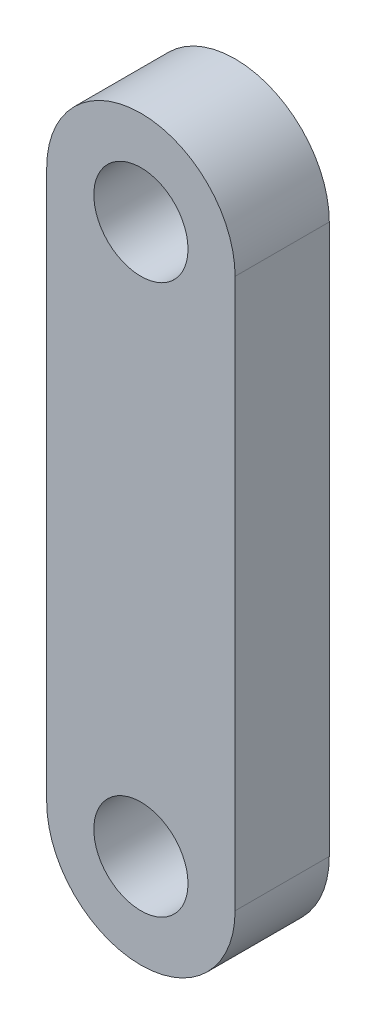
ISO-10303-21;
HEADER;
FILE_DESCRIPTION(('STEP AP214'),'2;1');
FILE_NAME('part.step','',(''),(''),'','','');
FILE_SCHEMA(('AUTOMOTIVE_DESIGN { 1 0 10303 214 1 1 1 1 }'));
ENDSEC;
DATA;
#1=APPLICATION_CONTEXT('core data for automotive mechanical design processes');
#2=APPLICATION_PROTOCOL_DEFINITION('international standard','automotive_design',2000,#1);
#3=PRODUCT_CONTEXT('',#1,'mechanical');
#4=PRODUCT('Part','Part','',(#3));
#5=PRODUCT_RELATED_PRODUCT_CATEGORY('part','',(#4));
#6=PRODUCT_DEFINITION_FORMATION('','',#4);
#7=PRODUCT_DEFINITION_CONTEXT('part definition',#1,'design');
#8=PRODUCT_DEFINITION('design','',#6,#7);
#9=PRODUCT_DEFINITION_SHAPE('','',#8);
#10=(LENGTH_UNIT() NAMED_UNIT(*) SI_UNIT(.MILLI.,.METRE.));
#11=(NAMED_UNIT(*) PLANE_ANGLE_UNIT() SI_UNIT($,.RADIAN.));
#12=(NAMED_UNIT(*) SI_UNIT($,.STERADIAN.) SOLID_ANGLE_UNIT());
#13=UNCERTAINTY_MEASURE_WITH_UNIT(LENGTH_MEASURE(1.E-05),#10,'distance_accuracy_value','');
#14=(GEOMETRIC_REPRESENTATION_CONTEXT(3) GLOBAL_UNCERTAINTY_ASSIGNED_CONTEXT((#13)) GLOBAL_UNIT_ASSIGNED_CONTEXT((#10,
#11,#12)) REPRESENTATION_CONTEXT('',''));
#15=CARTESIAN_POINT('',(0.,0.,0.));
#16=DIRECTION('',(0.,0.,1.));
#17=DIRECTION('',(1.,0.,0.));
#18=AXIS2_PLACEMENT_3D('',#15,#16,#17);
#19=CARTESIAN_POINT('',(0.,8.75,-4.5));
#20=DIRECTION('',(0.,0.,1.));
#21=DIRECTION('',(1.,0.,0.));
#22=AXIS2_PLACEMENT_3D('',#19,#20,#21);
#23=CYLINDRICAL_SURFACE('',#22,3.);
#24=CARTESIAN_POINT('',(0.,8.75,-1.5));
#25=DIRECTION('',(0.,0.,1.));
#26=DIRECTION('',(1.,0.,0.));
#27=AXIS2_PLACEMENT_3D('',#24,#25,#26);
#28=CIRCLE('',#27,3.);
#29=CARTESIAN_POINT('',(2.99999999999999,8.75,-1.5));
#30=VERTEX_POINT('',#29);
#31=CARTESIAN_POINT('',(-3.,8.75,-1.5));
#32=VERTEX_POINT('',#31);
#33=EDGE_CURVE('E100',#30,#32,#28,.T.);
#34=ORIENTED_EDGE('',*,*,#33,.F.);
#35=DIRECTION('',(0.,0.,1.));
#36=VECTOR('',#35,1.);
#37=CARTESIAN_POINT('',(2.99999999999999,8.75,-4.5));
#38=LINE('',#37,#36);
#39=CARTESIAN_POINT('',(2.99999999999999,8.75,-4.5));
#40=VERTEX_POINT('',#39);
#41=EDGE_CURVE('E11',#40,#30,#38,.T.);
#42=ORIENTED_EDGE('',*,*,#41,.F.);
#43=CARTESIAN_POINT('',(0.,8.75,-4.5));
#44=DIRECTION('',(0.,0.,1.));
#45=DIRECTION('',(1.,0.,0.));
#46=AXIS2_PLACEMENT_3D('',#43,#44,#45);
#47=CIRCLE('',#46,3.);
#48=CARTESIAN_POINT('',(-3.,8.75,-4.5));
#49=VERTEX_POINT('',#48);
#50=EDGE_CURVE('E93',#40,#49,#47,.T.);
#51=ORIENTED_EDGE('',*,*,#50,.T.);
#52=DIRECTION('',(0.,0.,1.));
#53=VECTOR('',#52,1.);
#54=CARTESIAN_POINT('',(-3.,8.75,-4.5));
#55=LINE('',#54,#53);
#56=EDGE_CURVE('E38',#49,#32,#55,.T.);
#57=ORIENTED_EDGE('',*,*,#56,.T.);
#58=EDGE_LOOP('',(#34,#42,#51,#57));
#59=FACE_BOUND('',#58,.T.);
#60=ADVANCED_FACE('F35',(#59),#23,.T.);
#61=CARTESIAN_POINT('',(2.99999999999999,8.75,-4.5));
#62=DIRECTION('',(1.,0.,0.));
#63=DIRECTION('',(0.,1.,0.));
#64=AXIS2_PLACEMENT_3D('',#61,#62,#63);
#65=PLANE('',#64);
#66=DIRECTION('',(0.,1.,0.));
#67=VECTOR('',#66,1.);
#68=CARTESIAN_POINT('',(2.99999999999999,8.75,-1.5));
#69=LINE('',#68,#67);
#70=CARTESIAN_POINT('',(3.,-8.75,-1.5));
#71=VERTEX_POINT('',#70);
#72=EDGE_CURVE('E95',#71,#30,#69,.T.);
#73=ORIENTED_EDGE('',*,*,#72,.F.);
#74=DIRECTION('',(0.,0.,1.));
#75=VECTOR('',#74,1.);
#76=CARTESIAN_POINT('',(3.,-8.75,-4.5));
#77=LINE('',#76,#75);
#78=CARTESIAN_POINT('',(3.,-8.75,-4.5));
#79=VERTEX_POINT('',#78);
#80=EDGE_CURVE('E44',#79,#71,#77,.T.);
#81=ORIENTED_EDGE('',*,*,#80,.F.);
#82=DIRECTION('',(0.,1.,0.));
#83=VECTOR('',#82,1.);
#84=CARTESIAN_POINT('',(2.99999999999999,8.75,-4.5));
#85=LINE('',#84,#83);
#86=EDGE_CURVE('E90',#79,#40,#85,.T.);
#87=ORIENTED_EDGE('',*,*,#86,.T.);
#88=ORIENTED_EDGE('',*,*,#41,.T.);
#89=EDGE_LOOP('',(#73,#81,#87,#88));
#90=FACE_BOUND('',#89,.T.);
#91=ADVANCED_FACE('F111',(#90),#65,.T.);
#92=CARTESIAN_POINT('',(0.,-8.75,-4.5));
#93=DIRECTION('',(0.,0.,1.));
#94=DIRECTION('',(1.,0.,0.));
#95=AXIS2_PLACEMENT_3D('',#92,#93,#94);
#96=CYLINDRICAL_SURFACE('',#95,3.);
#97=CARTESIAN_POINT('',(0.,-8.75,-1.5));
#98=DIRECTION('',(0.,0.,1.));
#99=DIRECTION('',(1.,0.,0.));
#100=AXIS2_PLACEMENT_3D('',#97,#98,#99);
#101=CIRCLE('',#100,3.);
#102=CARTESIAN_POINT('',(-3.,-8.75,-1.5));
#103=VERTEX_POINT('',#102);
#104=EDGE_CURVE('E85',#103,#71,#101,.T.);
#105=ORIENTED_EDGE('',*,*,#104,.F.);
#106=DIRECTION('',(0.,0.,1.));
#107=VECTOR('',#106,1.);
#108=CARTESIAN_POINT('',(-3.,-8.75,-4.5));
#109=LINE('',#108,#107);
#110=CARTESIAN_POINT('',(-3.,-8.75,-4.5));
#111=VERTEX_POINT('',#110);
#112=EDGE_CURVE('E80',#111,#103,#109,.T.);
#113=ORIENTED_EDGE('',*,*,#112,.F.);
#114=CARTESIAN_POINT('',(0.,-8.75,-4.5));
#115=DIRECTION('',(0.,0.,1.));
#116=DIRECTION('',(1.,0.,0.));
#117=AXIS2_PLACEMENT_3D('',#114,#115,#116);
#118=CIRCLE('',#117,3.);
#119=EDGE_CURVE('E83',#111,#79,#118,.T.);
#120=ORIENTED_EDGE('',*,*,#119,.T.);
#121=ORIENTED_EDGE('',*,*,#80,.T.);
#122=EDGE_LOOP('',(#105,#113,#120,#121));
#123=FACE_BOUND('',#122,.T.);
#124=ADVANCED_FACE('F82',(#123),#96,.T.);
#125=CARTESIAN_POINT('',(-3.,8.75,-4.5));
#126=DIRECTION('',(-1.,0.,0.));
#127=DIRECTION('',(0.,-1.,0.));
#128=AXIS2_PLACEMENT_3D('',#125,#126,#127);
#129=PLANE('',#128);
#130=DIRECTION('',(0.,-1.,0.));
#131=VECTOR('',#130,1.);
#132=CARTESIAN_POINT('',(-3.,8.75,-1.5));
#133=LINE('',#132,#131);
#134=EDGE_CURVE('E103',#32,#103,#133,.T.);
#135=ORIENTED_EDGE('',*,*,#134,.F.);
#136=ORIENTED_EDGE('',*,*,#56,.F.);
#137=DIRECTION('',(0.,-1.,0.));
#138=VECTOR('',#137,1.);
#139=CARTESIAN_POINT('',(-3.,8.75,-4.5));
#140=LINE('',#139,#138);
#141=EDGE_CURVE('E89',#49,#111,#140,.T.);
#142=ORIENTED_EDGE('',*,*,#141,.T.);
#143=ORIENTED_EDGE('',*,*,#112,.T.);
#144=EDGE_LOOP('',(#135,#136,#142,#143));
#145=FACE_BOUND('',#144,.T.);
#146=ADVANCED_FACE('F92',(#145),#129,.T.);
#147=CARTESIAN_POINT('',(0.,8.75,-4.5));
#148=DIRECTION('',(0.,0.,1.));
#149=DIRECTION('',(1.,0.,0.));
#150=AXIS2_PLACEMENT_3D('',#147,#148,#149);
#151=PLANE('',#150);
#152=CARTESIAN_POINT('',(0.,-8.75,-4.5));
#153=DIRECTION('',(0.,0.,1.));
#154=DIRECTION('',(1.,0.,0.));
#155=AXIS2_PLACEMENT_3D('',#152,#153,#154);
#156=CIRCLE('',#155,1.5);
#157=CARTESIAN_POINT('',(1.5,-8.75,-4.5));
#158=VERTEX_POINT('',#157);
#159=EDGE_CURVE('E144',#158,#158,#156,.T.);
#160=ORIENTED_EDGE('',*,*,#159,.T.);
#161=EDGE_LOOP('',(#160));
#162=FACE_BOUND('',#161,.T.);
#163=CARTESIAN_POINT('',(0.,8.75,-4.5));
#164=DIRECTION('',(0.,0.,1.));
#165=DIRECTION('',(1.,0.,0.));
#166=AXIS2_PLACEMENT_3D('',#163,#164,#165);
#167=CIRCLE('',#166,1.5);
#168=CARTESIAN_POINT('',(1.5,8.75,-4.5));
#169=VERTEX_POINT('',#168);
#170=EDGE_CURVE('E104',#169,#169,#167,.T.);
#171=ORIENTED_EDGE('',*,*,#170,.T.);
#172=EDGE_LOOP('',(#171));
#173=FACE_BOUND('',#172,.T.);
#174=ORIENTED_EDGE('',*,*,#50,.F.);
#175=ORIENTED_EDGE('',*,*,#86,.F.);
#176=ORIENTED_EDGE('',*,*,#119,.F.);
#177=ORIENTED_EDGE('',*,*,#141,.F.);
#178=EDGE_LOOP('',(#174,#175,#176,#177));
#179=FACE_BOUND('',#178,.T.);
#180=ADVANCED_FACE('F88',(#162,#173,#179),#151,.F.);
#181=CARTESIAN_POINT('',(0.,8.75,-1.5));
#182=DIRECTION('',(0.,0.,1.));
#183=DIRECTION('',(1.,0.,0.));
#184=AXIS2_PLACEMENT_3D('',#181,#182,#183);
#185=PLANE('',#184);
#186=CARTESIAN_POINT('',(0.,-8.75,-1.5));
#187=DIRECTION('',(0.,0.,1.));
#188=DIRECTION('',(1.,0.,0.));
#189=AXIS2_PLACEMENT_3D('',#186,#187,#188);
#190=CIRCLE('',#189,1.5);
#191=CARTESIAN_POINT('',(1.5,-8.75,-1.5));
#192=VERTEX_POINT('',#191);
#193=EDGE_CURVE('E147',#192,#192,#190,.T.);
#194=ORIENTED_EDGE('',*,*,#193,.F.);
#195=EDGE_LOOP('',(#194));
#196=FACE_BOUND('',#195,.T.);
#197=CARTESIAN_POINT('',(0.,8.75,-1.5));
#198=DIRECTION('',(0.,0.,1.));
#199=DIRECTION('',(1.,0.,0.));
#200=AXIS2_PLACEMENT_3D('',#197,#198,#199);
#201=CIRCLE('',#200,1.5);
#202=CARTESIAN_POINT('',(1.5,8.75,-1.5));
#203=VERTEX_POINT('',#202);
#204=EDGE_CURVE('E149',#203,#203,#201,.T.);
#205=ORIENTED_EDGE('',*,*,#204,.F.);
#206=EDGE_LOOP('',(#205));
#207=FACE_BOUND('',#206,.T.);
#208=ORIENTED_EDGE('',*,*,#33,.T.);
#209=ORIENTED_EDGE('',*,*,#134,.T.);
#210=ORIENTED_EDGE('',*,*,#104,.T.);
#211=ORIENTED_EDGE('',*,*,#72,.T.);
#212=EDGE_LOOP('',(#208,#209,#210,#211));
#213=FACE_BOUND('',#212,.T.);
#214=ADVANCED_FACE('F110',(#196,#207,#213),#185,.T.);
#215=CARTESIAN_POINT('',(0.,8.75,-4.5));
#216=DIRECTION('',(0.,0.,1.));
#217=DIRECTION('',(1.,0.,0.));
#218=AXIS2_PLACEMENT_3D('',#215,#216,#217);
#219=CYLINDRICAL_SURFACE('',#218,1.5);
#220=ORIENTED_EDGE('',*,*,#170,.F.);
#221=EDGE_LOOP('',(#220));
#222=FACE_BOUND('',#221,.T.);
#223=ORIENTED_EDGE('',*,*,#204,.T.);
#224=EDGE_LOOP('',(#223));
#225=FACE_BOUND('',#224,.T.);
#226=ADVANCED_FACE('F129',(#222,#225),#219,.F.);
#227=CARTESIAN_POINT('',(0.,-8.75,-4.5));
#228=DIRECTION('',(0.,0.,1.));
#229=DIRECTION('',(1.,0.,0.));
#230=AXIS2_PLACEMENT_3D('',#227,#228,#229);
#231=CYLINDRICAL_SURFACE('',#230,1.5);
#232=ORIENTED_EDGE('',*,*,#159,.F.);
#233=EDGE_LOOP('',(#232));
#234=FACE_BOUND('',#233,.T.);
#235=ORIENTED_EDGE('',*,*,#193,.T.);
#236=EDGE_LOOP('',(#235));
#237=FACE_BOUND('',#236,.T.);
#238=ADVANCED_FACE('F136',(#234,#237),#231,.F.);
#239=CLOSED_SHELL('',(#60,#91,#124,#146,#180,#214,#226,#238));
#240=MANIFOLD_SOLID_BREP('B2',#239);
#241=ADVANCED_BREP_SHAPE_REPRESENTATION('',(#18,#240),#14);
#242=SHAPE_DEFINITION_REPRESENTATION(#9,#241);
ENDSEC;
END-ISO-10303-21;
